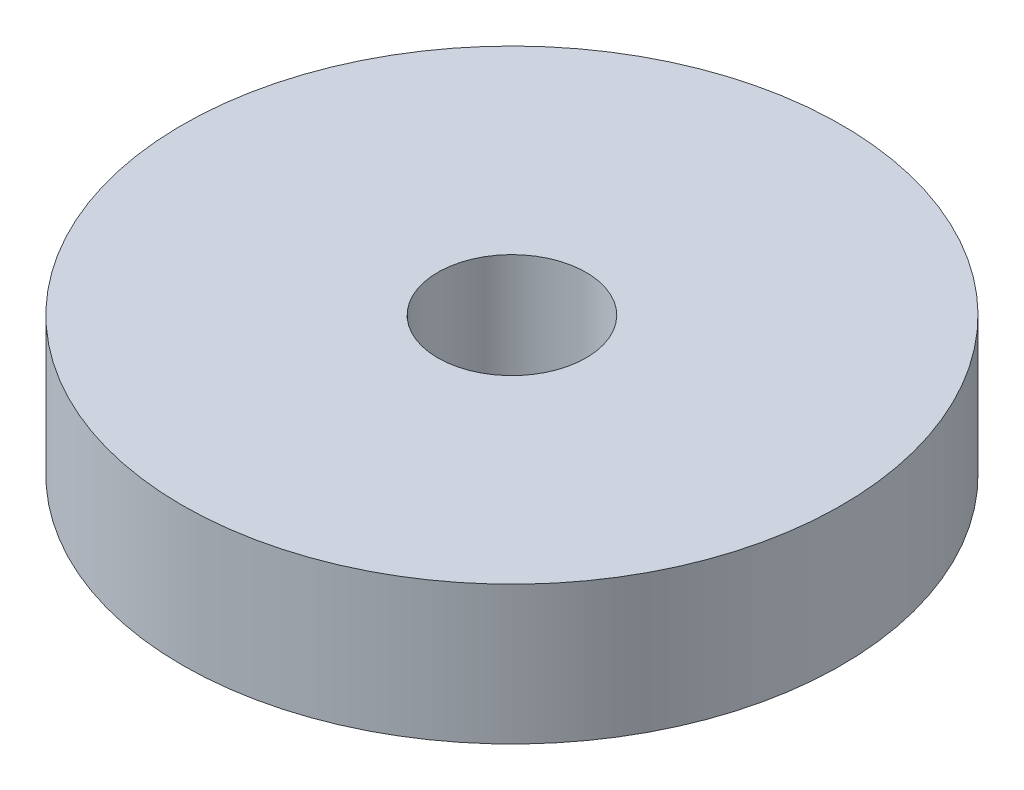
ISO-10303-21;
HEADER;
FILE_DESCRIPTION(('STEP AP214'),'2;1');
FILE_NAME('part.step','',(''),(''),'','','');
FILE_SCHEMA(('AUTOMOTIVE_DESIGN { 1 0 10303 214 1 1 1 1 }'));
ENDSEC;
DATA;
#1=APPLICATION_CONTEXT('core data for automotive mechanical design processes');
#2=APPLICATION_PROTOCOL_DEFINITION('international standard','automotive_design',2000,#1);
#3=PRODUCT_CONTEXT('',#1,'mechanical');
#4=PRODUCT('Part','Part','',(#3));
#5=PRODUCT_RELATED_PRODUCT_CATEGORY('part','',(#4));
#6=PRODUCT_DEFINITION_FORMATION('','',#4);
#7=PRODUCT_DEFINITION_CONTEXT('part definition',#1,'design');
#8=PRODUCT_DEFINITION('design','',#6,#7);
#9=PRODUCT_DEFINITION_SHAPE('','',#8);
#10=(LENGTH_UNIT() NAMED_UNIT(*) SI_UNIT(.MILLI.,.METRE.));
#11=(NAMED_UNIT(*) PLANE_ANGLE_UNIT() SI_UNIT($,.RADIAN.));
#12=(NAMED_UNIT(*) SI_UNIT($,.STERADIAN.) SOLID_ANGLE_UNIT());
#13=UNCERTAINTY_MEASURE_WITH_UNIT(LENGTH_MEASURE(1.E-05),#10,'distance_accuracy_value','');
#14=(GEOMETRIC_REPRESENTATION_CONTEXT(3) GLOBAL_UNCERTAINTY_ASSIGNED_CONTEXT((#13)) GLOBAL_UNIT_ASSIGNED_CONTEXT((#10,
#11,#12)) REPRESENTATION_CONTEXT('',''));
#15=CARTESIAN_POINT('',(0.,0.,0.));
#16=DIRECTION('',(0.,0.,1.));
#17=DIRECTION('',(1.,0.,0.));
#18=AXIS2_PLACEMENT_3D('',#15,#16,#17);
#19=CARTESIAN_POINT('',(0.,4.2,0.));
#20=DIRECTION('',(0.,-1.,0.));
#21=DIRECTION('',(0.,0.,-1.));
#22=AXIS2_PLACEMENT_3D('',#19,#20,#21);
#23=CYLINDRICAL_SURFACE('',#22,10.);
#24=CARTESIAN_POINT('',(0.,4.2,0.));
#25=DIRECTION('',(0.,1.,0.));
#26=DIRECTION('',(0.,0.,1.));
#27=AXIS2_PLACEMENT_3D('',#24,#25,#26);
#28=CIRCLE('',#27,10.);
#29=CARTESIAN_POINT('',(0.,4.2,10.));
#30=VERTEX_POINT('',#29);
#31=EDGE_CURVE('E10',#30,#30,#28,.T.);
#32=ORIENTED_EDGE('',*,*,#31,.F.);
#33=EDGE_LOOP('',(#32));
#34=FACE_BOUND('',#33,.T.);
#35=CARTESIAN_POINT('',(0.,0.,0.));
#36=DIRECTION('',(0.,1.,0.));
#37=DIRECTION('',(0.,0.,1.));
#38=AXIS2_PLACEMENT_3D('',#35,#36,#37);
#39=CIRCLE('',#38,10.);
#40=CARTESIAN_POINT('',(0.,0.,10.));
#41=VERTEX_POINT('',#40);
#42=EDGE_CURVE('E36',#41,#41,#39,.T.);
#43=ORIENTED_EDGE('',*,*,#42,.T.);
#44=EDGE_LOOP('',(#43));
#45=FACE_BOUND('',#44,.T.);
#46=ADVANCED_FACE('F33',(#34,#45),#23,.T.);
#47=CARTESIAN_POINT('',(0.,4.2,0.));
#48=DIRECTION('',(0.,1.,0.));
#49=DIRECTION('',(0.,0.,1.));
#50=AXIS2_PLACEMENT_3D('',#47,#48,#49);
#51=PLANE('',#50);
#52=CARTESIAN_POINT('',(0.,4.2,0.));
#53=DIRECTION('',(0.,1.,0.));
#54=DIRECTION('',(0.,0.,1.));
#55=AXIS2_PLACEMENT_3D('',#52,#53,#54);
#56=CIRCLE('',#55,2.24999999999999);
#57=CARTESIAN_POINT('',(0.,4.2,2.24999999999999));
#58=VERTEX_POINT('',#57);
#59=EDGE_CURVE('E47',#58,#58,#56,.T.);
#60=ORIENTED_EDGE('',*,*,#59,.F.);
#61=EDGE_LOOP('',(#60));
#62=FACE_BOUND('',#61,.T.);
#63=ORIENTED_EDGE('',*,*,#31,.T.);
#64=EDGE_LOOP('',(#63));
#65=FACE_BOUND('',#64,.T.);
#66=ADVANCED_FACE('F53',(#62,#65),#51,.T.);
#67=CARTESIAN_POINT('',(0.,0.,0.));
#68=DIRECTION('',(0.,1.,0.));
#69=DIRECTION('',(0.,0.,1.));
#70=AXIS2_PLACEMENT_3D('',#67,#68,#69);
#71=PLANE('',#70);
#72=CARTESIAN_POINT('',(0.,0.,0.));
#73=DIRECTION('',(0.,1.,0.));
#74=DIRECTION('',(0.,0.,1.));
#75=AXIS2_PLACEMENT_3D('',#72,#73,#74);
#76=CIRCLE('',#75,2.25);
#77=CARTESIAN_POINT('',(0.,0.,2.25));
#78=VERTEX_POINT('',#77);
#79=EDGE_CURVE('E43',#78,#78,#76,.T.);
#80=ORIENTED_EDGE('',*,*,#79,.T.);
#81=EDGE_LOOP('',(#80));
#82=FACE_BOUND('',#81,.T.);
#83=ORIENTED_EDGE('',*,*,#42,.F.);
#84=EDGE_LOOP('',(#83));
#85=FACE_BOUND('',#84,.T.);
#86=ADVANCED_FACE('F55',(#82,#85),#71,.F.);
#87=CARTESIAN_POINT('',(0.,4.2,0.));
#88=DIRECTION('',(0.,1.,0.));
#89=DIRECTION('',(0.,0.,1.));
#90=AXIS2_PLACEMENT_3D('',#87,#88,#89);
#91=CYLINDRICAL_SURFACE('',#90,2.24999999999999);
#92=ORIENTED_EDGE('',*,*,#79,.F.);
#93=EDGE_LOOP('',(#92));
#94=FACE_BOUND('',#93,.T.);
#95=ORIENTED_EDGE('',*,*,#59,.T.);
#96=EDGE_LOOP('',(#95));
#97=FACE_BOUND('',#96,.T.);
#98=ADVANCED_FACE('F51',(#94,#97),#91,.F.);
#99=CLOSED_SHELL('',(#46,#66,#86,#98));
#100=MANIFOLD_SOLID_BREP('B2',#99);
#101=ADVANCED_BREP_SHAPE_REPRESENTATION('',(#18,#100),#14);
#102=SHAPE_DEFINITION_REPRESENTATION(#9,#101);
ENDSEC;
END-ISO-10303-21;
